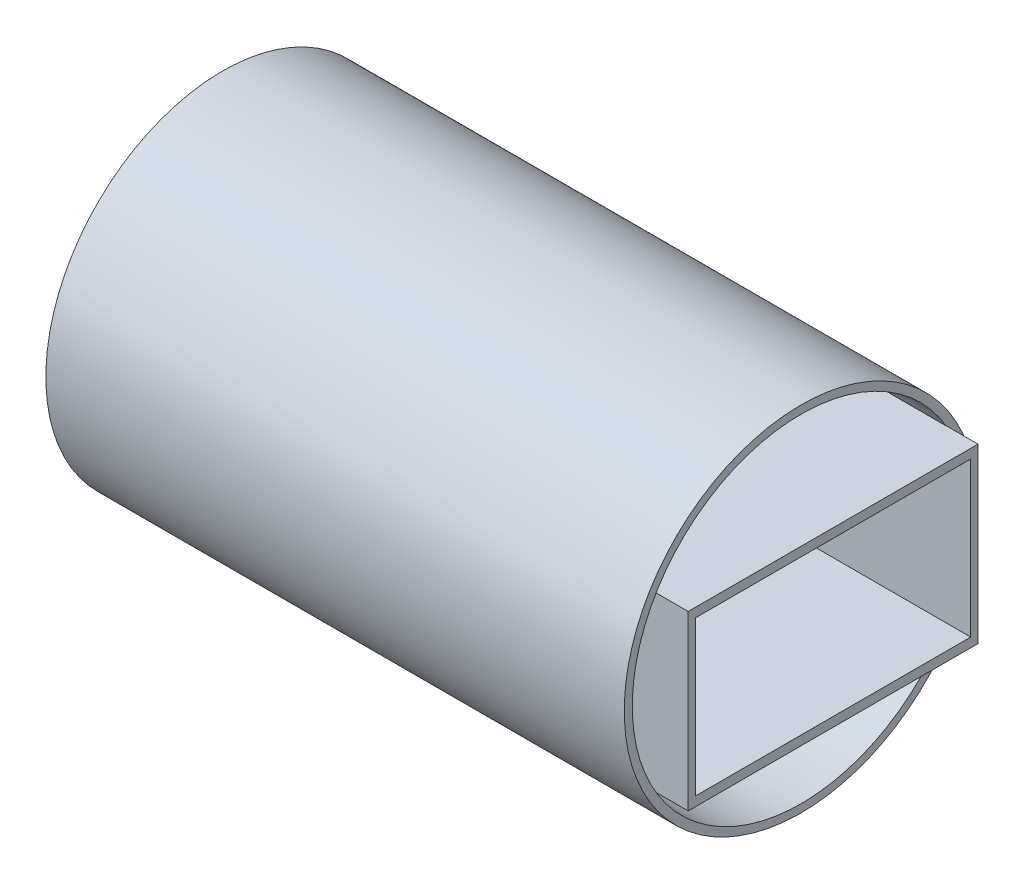
ISO-10303-21;
HEADER;
FILE_DESCRIPTION(('STEP AP214'),'2;1');
FILE_NAME('part.step','',(''),(''),'','','');
FILE_SCHEMA(('AUTOMOTIVE_DESIGN { 1 0 10303 214 1 1 1 1 }'));
ENDSEC;
DATA;
#1=APPLICATION_CONTEXT('core data for automotive mechanical design processes');
#2=APPLICATION_PROTOCOL_DEFINITION('international standard','automotive_design',2000,#1);
#3=PRODUCT_CONTEXT('',#1,'mechanical');
#4=PRODUCT('Part','Part','',(#3));
#5=PRODUCT_RELATED_PRODUCT_CATEGORY('part','',(#4));
#6=PRODUCT_DEFINITION_FORMATION('','',#4);
#7=PRODUCT_DEFINITION_CONTEXT('part definition',#1,'design');
#8=PRODUCT_DEFINITION('design','',#6,#7);
#9=PRODUCT_DEFINITION_SHAPE('','',#8);
#10=(LENGTH_UNIT() NAMED_UNIT(*) SI_UNIT(.MILLI.,.METRE.));
#11=(NAMED_UNIT(*) PLANE_ANGLE_UNIT() SI_UNIT($,.RADIAN.));
#12=(NAMED_UNIT(*) SI_UNIT($,.STERADIAN.) SOLID_ANGLE_UNIT());
#13=UNCERTAINTY_MEASURE_WITH_UNIT(LENGTH_MEASURE(1.E-05),#10,'distance_accuracy_value','');
#14=(GEOMETRIC_REPRESENTATION_CONTEXT(3) GLOBAL_UNCERTAINTY_ASSIGNED_CONTEXT((#13)) GLOBAL_UNIT_ASSIGNED_CONTEXT((#10,
#11,#12)) REPRESENTATION_CONTEXT('',''));
#15=CARTESIAN_POINT('',(0.,0.,0.));
#16=DIRECTION('',(0.,0.,1.));
#17=DIRECTION('',(1.,0.,0.));
#18=AXIS2_PLACEMENT_3D('',#15,#16,#17);
#19=CARTESIAN_POINT('',(482.6,68.2947864006803,-114.534032717291));
#20=DIRECTION('',(0.,0.,-1.));
#21=DIRECTION('',(-1.,0.,0.));
#22=AXIS2_PLACEMENT_3D('',#19,#20,#21);
#23=PLANE('',#22);
#24=DIRECTION('',(0.,-1.,0.));
#25=VECTOR('',#24,1.);
#26=CARTESIAN_POINT('',(0.,68.2947864006803,-114.534032717291));
#27=LINE('',#26,#25);
#28=CARTESIAN_POINT('',(0.,68.2947864006803,-114.534032717291));
#29=VERTEX_POINT('',#28);
#30=CARTESIAN_POINT('',(0.,-68.2947864006803,-114.534032717291));
#31=VERTEX_POINT('',#30);
#32=EDGE_CURVE('E147',#29,#31,#27,.T.);
#33=ORIENTED_EDGE('',*,*,#32,.F.);
#34=DIRECTION('',(-1.,0.,0.));
#35=VECTOR('',#34,1.);
#36=CARTESIAN_POINT('',(482.6,68.2947864006803,-114.534032717291));
#37=LINE('',#36,#35);
#38=CARTESIAN_POINT('',(482.6,68.2947864006803,-114.534032717291));
#39=VERTEX_POINT('',#38);
#40=EDGE_CURVE('E12',#39,#29,#37,.T.);
#41=ORIENTED_EDGE('',*,*,#40,.F.);
#42=DIRECTION('',(0.,-1.,0.));
#43=VECTOR('',#42,1.);
#44=CARTESIAN_POINT('',(482.6,68.2947864006803,-114.534032717291));
#45=LINE('',#44,#43);
#46=CARTESIAN_POINT('',(482.6,-68.2947864006803,-114.534032717291));
#47=VERTEX_POINT('',#46);
#48=EDGE_CURVE('E151',#39,#47,#45,.T.);
#49=ORIENTED_EDGE('',*,*,#48,.T.);
#50=DIRECTION('',(-1.,0.,0.));
#51=VECTOR('',#50,1.);
#52=CARTESIAN_POINT('',(482.6,-68.2947864006803,-114.534032717291));
#53=LINE('',#52,#51);
#54=EDGE_CURVE('E52',#47,#31,#53,.T.);
#55=ORIENTED_EDGE('',*,*,#54,.T.);
#56=EDGE_LOOP('',(#33,#41,#49,#55));
#57=FACE_BOUND('',#56,.T.);
#58=ADVANCED_FACE('F49',(#57),#23,.T.);
#59=CARTESIAN_POINT('',(482.6,68.2947864006803,114.534032717291));
#60=DIRECTION('',(0.,1.,0.));
#61=DIRECTION('',(0.,0.,1.));
#62=AXIS2_PLACEMENT_3D('',#59,#60,#61);
#63=PLANE('',#62);
#64=DIRECTION('',(0.,0.,-1.));
#65=VECTOR('',#64,1.);
#66=CARTESIAN_POINT('',(0.,68.2947864006803,114.534032717291));
#67=LINE('',#66,#65);
#68=CARTESIAN_POINT('',(0.,68.2947864006803,114.534032717291));
#69=VERTEX_POINT('',#68);
#70=EDGE_CURVE('E155',#69,#29,#67,.T.);
#71=ORIENTED_EDGE('',*,*,#70,.F.);
#72=DIRECTION('',(-1.,0.,0.));
#73=VECTOR('',#72,1.);
#74=CARTESIAN_POINT('',(482.6,68.2947864006803,114.534032717291));
#75=LINE('',#74,#73);
#76=CARTESIAN_POINT('',(482.6,68.2947864006803,114.534032717291));
#77=VERTEX_POINT('',#76);
#78=EDGE_CURVE('E57',#77,#69,#75,.T.);
#79=ORIENTED_EDGE('',*,*,#78,.F.);
#80=DIRECTION('',(0.,0.,-1.));
#81=VECTOR('',#80,1.);
#82=CARTESIAN_POINT('',(482.6,68.2947864006803,114.534032717291));
#83=LINE('',#82,#81);
#84=EDGE_CURVE('E161',#77,#39,#83,.T.);
#85=ORIENTED_EDGE('',*,*,#84,.T.);
#86=ORIENTED_EDGE('',*,*,#40,.T.);
#87=EDGE_LOOP('',(#71,#79,#85,#86));
#88=FACE_BOUND('',#87,.T.);
#89=ADVANCED_FACE('F187',(#88),#63,.T.);
#90=CARTESIAN_POINT('',(482.6,68.2947864006803,114.534032717291));
#91=DIRECTION('',(0.,0.,1.));
#92=DIRECTION('',(1.,0.,0.));
#93=AXIS2_PLACEMENT_3D('',#90,#91,#92);
#94=PLANE('',#93);
#95=DIRECTION('',(0.,1.,0.));
#96=VECTOR('',#95,1.);
#97=CARTESIAN_POINT('',(0.,68.2947864006803,114.534032717291));
#98=LINE('',#97,#96);
#99=CARTESIAN_POINT('',(0.,-68.2947864006803,114.534032717291));
#100=VERTEX_POINT('',#99);
#101=EDGE_CURVE('E169',#100,#69,#98,.T.);
#102=ORIENTED_EDGE('',*,*,#101,.F.);
#103=DIRECTION('',(-1.,0.,0.));
#104=VECTOR('',#103,1.);
#105=CARTESIAN_POINT('',(482.6,-68.2947864006803,114.534032717291));
#106=LINE('',#105,#104);
#107=CARTESIAN_POINT('',(482.6,-68.2947864006803,114.534032717291));
#108=VERTEX_POINT('',#107);
#109=EDGE_CURVE('E174',#108,#100,#106,.T.);
#110=ORIENTED_EDGE('',*,*,#109,.F.);
#111=DIRECTION('',(0.,1.,0.));
#112=VECTOR('',#111,1.);
#113=CARTESIAN_POINT('',(482.6,68.2947864006803,114.534032717291));
#114=LINE('',#113,#112);
#115=EDGE_CURVE('E158',#108,#77,#114,.T.);
#116=ORIENTED_EDGE('',*,*,#115,.T.);
#117=ORIENTED_EDGE('',*,*,#78,.T.);
#118=EDGE_LOOP('',(#102,#110,#116,#117));
#119=FACE_BOUND('',#118,.T.);
#120=ADVANCED_FACE('F191',(#119),#94,.T.);
#121=CARTESIAN_POINT('',(482.6,-68.2947864006803,114.534032717291));
#122=DIRECTION('',(0.,-1.,0.));
#123=DIRECTION('',(0.,0.,-1.));
#124=AXIS2_PLACEMENT_3D('',#121,#122,#123);
#125=PLANE('',#124);
#126=DIRECTION('',(0.,0.,1.));
#127=VECTOR('',#126,1.);
#128=CARTESIAN_POINT('',(0.,-68.2947864006803,114.534032717291));
#129=LINE('',#128,#127);
#130=EDGE_CURVE('E166',#31,#100,#129,.T.);
#131=ORIENTED_EDGE('',*,*,#130,.F.);
#132=ORIENTED_EDGE('',*,*,#54,.F.);
#133=DIRECTION('',(0.,0.,1.));
#134=VECTOR('',#133,1.);
#135=CARTESIAN_POINT('',(482.6,-68.2947864006803,114.534032717291));
#136=LINE('',#135,#134);
#137=EDGE_CURVE('E154',#47,#108,#136,.T.);
#138=ORIENTED_EDGE('',*,*,#137,.T.);
#139=ORIENTED_EDGE('',*,*,#109,.T.);
#140=EDGE_LOOP('',(#131,#132,#138,#139));
#141=FACE_BOUND('',#140,.T.);
#142=ADVANCED_FACE('F182',(#141),#125,.T.);
#143=CARTESIAN_POINT('',(482.6,0.,0.));
#144=DIRECTION('',(1.,0.,0.));
#145=DIRECTION('',(0.,0.,-1.));
#146=AXIS2_PLACEMENT_3D('',#143,#144,#145);
#147=PLANE('',#146);
#148=DIRECTION('',(0.,-1.,0.));
#149=VECTOR('',#148,1.);
#150=CARTESIAN_POINT('',(482.6,61.0145171317487,-108.746067203253));
#151=LINE('',#150,#149);
#152=CARTESIAN_POINT('',(482.6,61.0145171317487,-108.746067203253));
#153=VERTEX_POINT('',#152);
#154=CARTESIAN_POINT('',(482.6,-60.9054828682512,-108.746067203253));
#155=VERTEX_POINT('',#154);
#156=EDGE_CURVE('E116',#153,#155,#151,.T.);
#157=ORIENTED_EDGE('',*,*,#156,.T.);
#158=DIRECTION('',(0.,0.,1.));
#159=VECTOR('',#158,1.);
#160=CARTESIAN_POINT('',(482.6,-60.9054828682512,108.746067203253));
#161=LINE('',#160,#159);
#162=CARTESIAN_POINT('',(482.6,-60.9054828682512,108.746067203253));
#163=VERTEX_POINT('',#162);
#164=EDGE_CURVE('E125',#155,#163,#161,.T.);
#165=ORIENTED_EDGE('',*,*,#164,.T.);
#166=DIRECTION('',(0.,1.,0.));
#167=VECTOR('',#166,1.);
#168=CARTESIAN_POINT('',(482.6,61.0145171317488,108.746067203253));
#169=LINE('',#168,#167);
#170=CARTESIAN_POINT('',(482.6,61.0145171317488,108.746067203253));
#171=VERTEX_POINT('',#170);
#172=EDGE_CURVE('E65',#163,#171,#169,.T.);
#173=ORIENTED_EDGE('',*,*,#172,.T.);
#174=DIRECTION('',(0.,0.,-1.));
#175=VECTOR('',#174,1.);
#176=CARTESIAN_POINT('',(482.6,61.0145171317488,108.746067203253));
#177=LINE('',#176,#175);
#178=EDGE_CURVE('E122',#171,#153,#177,.T.);
#179=ORIENTED_EDGE('',*,*,#178,.T.);
#180=EDGE_LOOP('',(#157,#165,#173,#179));
#181=FACE_BOUND('',#180,.T.);
#182=ORIENTED_EDGE('',*,*,#48,.F.);
#183=ORIENTED_EDGE('',*,*,#84,.F.);
#184=ORIENTED_EDGE('',*,*,#115,.F.);
#185=ORIENTED_EDGE('',*,*,#137,.F.);
#186=EDGE_LOOP('',(#182,#183,#184,#185));
#187=FACE_BOUND('',#186,.T.);
#188=ADVANCED_FACE('F129',(#181,#187),#147,.T.);
#189=CARTESIAN_POINT('',(0.,0.,0.));
#190=DIRECTION('',(1.,0.,0.));
#191=DIRECTION('',(0.,0.,-1.));
#192=AXIS2_PLACEMENT_3D('',#189,#190,#191);
#193=PLANE('',#192);
#194=DIRECTION('',(0.,0.,1.));
#195=VECTOR('',#194,1.);
#196=CARTESIAN_POINT('',(0.,-60.9054828682512,108.746067203253));
#197=LINE('',#196,#195);
#198=CARTESIAN_POINT('',(0.,-60.9054828682512,-108.746067203253));
#199=VERTEX_POINT('',#198);
#200=CARTESIAN_POINT('',(0.,-60.9054828682512,108.746067203253));
#201=VERTEX_POINT('',#200);
#202=EDGE_CURVE('E141',#199,#201,#197,.T.);
#203=ORIENTED_EDGE('',*,*,#202,.F.);
#204=DIRECTION('',(0.,-1.,0.));
#205=VECTOR('',#204,1.);
#206=CARTESIAN_POINT('',(0.,61.0145171317487,-108.746067203253));
#207=LINE('',#206,#205);
#208=CARTESIAN_POINT('',(0.,61.0145171317487,-108.746067203253));
#209=VERTEX_POINT('',#208);
#210=EDGE_CURVE('E73',#209,#199,#207,.T.);
#211=ORIENTED_EDGE('',*,*,#210,.F.);
#212=DIRECTION('',(0.,0.,-1.));
#213=VECTOR('',#212,1.);
#214=CARTESIAN_POINT('',(0.,61.0145171317488,108.746067203253));
#215=LINE('',#214,#213);
#216=CARTESIAN_POINT('',(0.,61.0145171317488,108.746067203253));
#217=VERTEX_POINT('',#216);
#218=EDGE_CURVE('E132',#217,#209,#215,.T.);
#219=ORIENTED_EDGE('',*,*,#218,.F.);
#220=DIRECTION('',(0.,1.,0.));
#221=VECTOR('',#220,1.);
#222=CARTESIAN_POINT('',(0.,61.0145171317488,108.746067203253));
#223=LINE('',#222,#221);
#224=EDGE_CURVE('E135',#201,#217,#223,.T.);
#225=ORIENTED_EDGE('',*,*,#224,.F.);
#226=EDGE_LOOP('',(#203,#211,#219,#225));
#227=FACE_BOUND('',#226,.T.);
#228=ORIENTED_EDGE('',*,*,#32,.T.);
#229=ORIENTED_EDGE('',*,*,#130,.T.);
#230=ORIENTED_EDGE('',*,*,#101,.T.);
#231=ORIENTED_EDGE('',*,*,#70,.T.);
#232=EDGE_LOOP('',(#228,#229,#230,#231));
#233=FACE_BOUND('',#232,.T.);
#234=ADVANCED_FACE('F184',(#227,#233),#193,.F.);
#235=CARTESIAN_POINT('',(482.6,61.0145171317487,-108.746067203253));
#236=DIRECTION('',(0.,0.,-1.));
#237=DIRECTION('',(0.,1.,0.));
#238=AXIS2_PLACEMENT_3D('',#235,#236,#237);
#239=PLANE('',#238);
#240=ORIENTED_EDGE('',*,*,#210,.T.);
#241=DIRECTION('',(-1.,0.,0.));
#242=VECTOR('',#241,1.);
#243=CARTESIAN_POINT('',(482.6,-60.9054828682512,-108.746067203253));
#244=LINE('',#243,#242);
#245=EDGE_CURVE('E112',#155,#199,#244,.T.);
#246=ORIENTED_EDGE('',*,*,#245,.F.);
#247=ORIENTED_EDGE('',*,*,#156,.F.);
#248=DIRECTION('',(-1.,0.,0.));
#249=VECTOR('',#248,1.);
#250=CARTESIAN_POINT('',(482.6,61.0145171317487,-108.746067203253));
#251=LINE('',#250,#249);
#252=EDGE_CURVE('E145',#153,#209,#251,.T.);
#253=ORIENTED_EDGE('',*,*,#252,.T.);
#254=EDGE_LOOP('',(#240,#246,#247,#253));
#255=FACE_BOUND('',#254,.T.);
#256=ADVANCED_FACE('F114',(#255),#239,.F.);
#257=CARTESIAN_POINT('',(482.6,61.0145171317488,108.746067203253));
#258=DIRECTION('',(0.,1.,0.));
#259=DIRECTION('',(0.,0.,1.));
#260=AXIS2_PLACEMENT_3D('',#257,#258,#259);
#261=PLANE('',#260);
#262=ORIENTED_EDGE('',*,*,#218,.T.);
#263=ORIENTED_EDGE('',*,*,#252,.F.);
#264=ORIENTED_EDGE('',*,*,#178,.F.);
#265=DIRECTION('',(-1.,0.,0.));
#266=VECTOR('',#265,1.);
#267=CARTESIAN_POINT('',(482.6,61.0145171317488,108.746067203253));
#268=LINE('',#267,#266);
#269=EDGE_CURVE('E148',#171,#217,#268,.T.);
#270=ORIENTED_EDGE('',*,*,#269,.T.);
#271=EDGE_LOOP('',(#262,#263,#264,#270));
#272=FACE_BOUND('',#271,.T.);
#273=ADVANCED_FACE('F242',(#272),#261,.F.);
#274=CARTESIAN_POINT('',(482.6,61.0145171317488,108.746067203253));
#275=DIRECTION('',(0.,0.,1.));
#276=DIRECTION('',(0.,-1.,0.));
#277=AXIS2_PLACEMENT_3D('',#274,#275,#276);
#278=PLANE('',#277);
#279=ORIENTED_EDGE('',*,*,#224,.T.);
#280=ORIENTED_EDGE('',*,*,#269,.F.);
#281=ORIENTED_EDGE('',*,*,#172,.F.);
#282=DIRECTION('',(-1.,0.,0.));
#283=VECTOR('',#282,1.);
#284=CARTESIAN_POINT('',(482.6,-60.9054828682512,108.746067203253));
#285=LINE('',#284,#283);
#286=EDGE_CURVE('E121',#163,#201,#285,.T.);
#287=ORIENTED_EDGE('',*,*,#286,.T.);
#288=EDGE_LOOP('',(#279,#280,#281,#287));
#289=FACE_BOUND('',#288,.T.);
#290=ADVANCED_FACE('F251',(#289),#278,.F.);
#291=CARTESIAN_POINT('',(482.6,-60.9054828682512,108.746067203253));
#292=DIRECTION('',(0.,-1.,0.));
#293=DIRECTION('',(0.,0.,-1.));
#294=AXIS2_PLACEMENT_3D('',#291,#292,#293);
#295=PLANE('',#294);
#296=ORIENTED_EDGE('',*,*,#202,.T.);
#297=ORIENTED_EDGE('',*,*,#286,.F.);
#298=ORIENTED_EDGE('',*,*,#164,.F.);
#299=ORIENTED_EDGE('',*,*,#245,.T.);
#300=EDGE_LOOP('',(#296,#297,#298,#299));
#301=FACE_BOUND('',#300,.T.);
#302=ADVANCED_FACE('F126',(#301),#295,.F.);
#303=CLOSED_SHELL('',(#58,#89,#120,#142,#188,#234,#256,#273,#290,#302));
#304=MANIFOLD_SOLID_BREP('B2',#303);
#305=CARTESIAN_POINT('',(457.2,0.,0.));
#306=DIRECTION('',(1.,0.,0.));
#307=DIRECTION('',(0.,0.,-1.));
#308=AXIS2_PLACEMENT_3D('',#305,#306,#307);
#309=PLANE('',#308);
#310=CARTESIAN_POINT('',(457.2,0.,0.));
#311=DIRECTION('',(1.,0.,0.));
#312=DIRECTION('',(0.,0.,-1.));
#313=AXIS2_PLACEMENT_3D('',#310,#311,#312);
#314=CIRCLE('',#313,139.7);
#315=CARTESIAN_POINT('',(457.2,0.,-139.7));
#316=VERTEX_POINT('',#315);
#317=EDGE_CURVE('E48',#316,#316,#314,.T.);
#318=ORIENTED_EDGE('',*,*,#317,.T.);
#319=EDGE_LOOP('',(#318));
#320=FACE_BOUND('',#319,.T.);
#321=CARTESIAN_POINT('',(457.2,0.,0.));
#322=DIRECTION('',(1.,0.,0.));
#323=DIRECTION('',(0.,0.,-1.));
#324=AXIS2_PLACEMENT_3D('',#321,#322,#323);
#325=CIRCLE('',#324,133.35);
#326=CARTESIAN_POINT('',(457.2,0.,-133.35));
#327=VERTEX_POINT('',#326);
#328=EDGE_CURVE('E289',#327,#327,#325,.T.);
#329=ORIENTED_EDGE('',*,*,#328,.F.);
#330=EDGE_LOOP('',(#329));
#331=FACE_BOUND('',#330,.T.);
#332=ADVANCED_FACE('F278',(#320,#331),#309,.T.);
#333=CARTESIAN_POINT('',(0.,0.,0.));
#334=DIRECTION('',(1.,0.,0.));
#335=DIRECTION('',(0.,0.,-1.));
#336=AXIS2_PLACEMENT_3D('',#333,#334,#335);
#337=PLANE('',#336);
#338=CARTESIAN_POINT('',(0.,0.,0.));
#339=DIRECTION('',(1.,0.,0.));
#340=DIRECTION('',(0.,0.,-1.));
#341=AXIS2_PLACEMENT_3D('',#338,#339,#340);
#342=CIRCLE('',#341,139.7);
#343=CARTESIAN_POINT('',(0.,0.,-139.7));
#344=VERTEX_POINT('',#343);
#345=EDGE_CURVE('E282',#344,#344,#342,.T.);
#346=ORIENTED_EDGE('',*,*,#345,.F.);
#347=EDGE_LOOP('',(#346));
#348=FACE_BOUND('',#347,.T.);
#349=CARTESIAN_POINT('',(0.,0.,0.));
#350=DIRECTION('',(1.,0.,0.));
#351=DIRECTION('',(0.,0.,-1.));
#352=AXIS2_PLACEMENT_3D('',#349,#350,#351);
#353=CIRCLE('',#352,133.35);
#354=CARTESIAN_POINT('',(0.,0.,-133.35));
#355=VERTEX_POINT('',#354);
#356=EDGE_CURVE('E291',#355,#355,#353,.T.);
#357=ORIENTED_EDGE('',*,*,#356,.T.);
#358=EDGE_LOOP('',(#357));
#359=FACE_BOUND('',#358,.T.);
#360=ADVANCED_FACE('F301',(#348,#359),#337,.F.);
#361=CARTESIAN_POINT('',(457.2,0.,0.));
#362=DIRECTION('',(-1.,0.,0.));
#363=DIRECTION('',(0.,0.,1.));
#364=AXIS2_PLACEMENT_3D('',#361,#362,#363);
#365=CYLINDRICAL_SURFACE('',#364,139.7);
#366=ORIENTED_EDGE('',*,*,#317,.F.);
#367=EDGE_LOOP('',(#366));
#368=FACE_BOUND('',#367,.T.);
#369=ORIENTED_EDGE('',*,*,#345,.T.);
#370=EDGE_LOOP('',(#369));
#371=FACE_BOUND('',#370,.T.);
#372=ADVANCED_FACE('F280',(#368,#371),#365,.T.);
#373=CARTESIAN_POINT('',(457.2,0.,0.));
#374=DIRECTION('',(-1.,0.,0.));
#375=DIRECTION('',(0.,0.,1.));
#376=AXIS2_PLACEMENT_3D('',#373,#374,#375);
#377=CYLINDRICAL_SURFACE('',#376,133.35);
#378=ORIENTED_EDGE('',*,*,#328,.T.);
#379=EDGE_LOOP('',(#378));
#380=FACE_BOUND('',#379,.T.);
#381=ORIENTED_EDGE('',*,*,#356,.F.);
#382=EDGE_LOOP('',(#381));
#383=FACE_BOUND('',#382,.T.);
#384=ADVANCED_FACE('F297',(#380,#383),#377,.F.);
#385=CLOSED_SHELL('',(#332,#360,#372,#384));
#386=MANIFOLD_SOLID_BREP('B6_NOT_SHOWN',#385);
#387=ADVANCED_BREP_SHAPE_REPRESENTATION('',(#18,#304,#386),#14);
#388=SHAPE_DEFINITION_REPRESENTATION(#9,#387);
ENDSEC;
END-ISO-10303-21;
